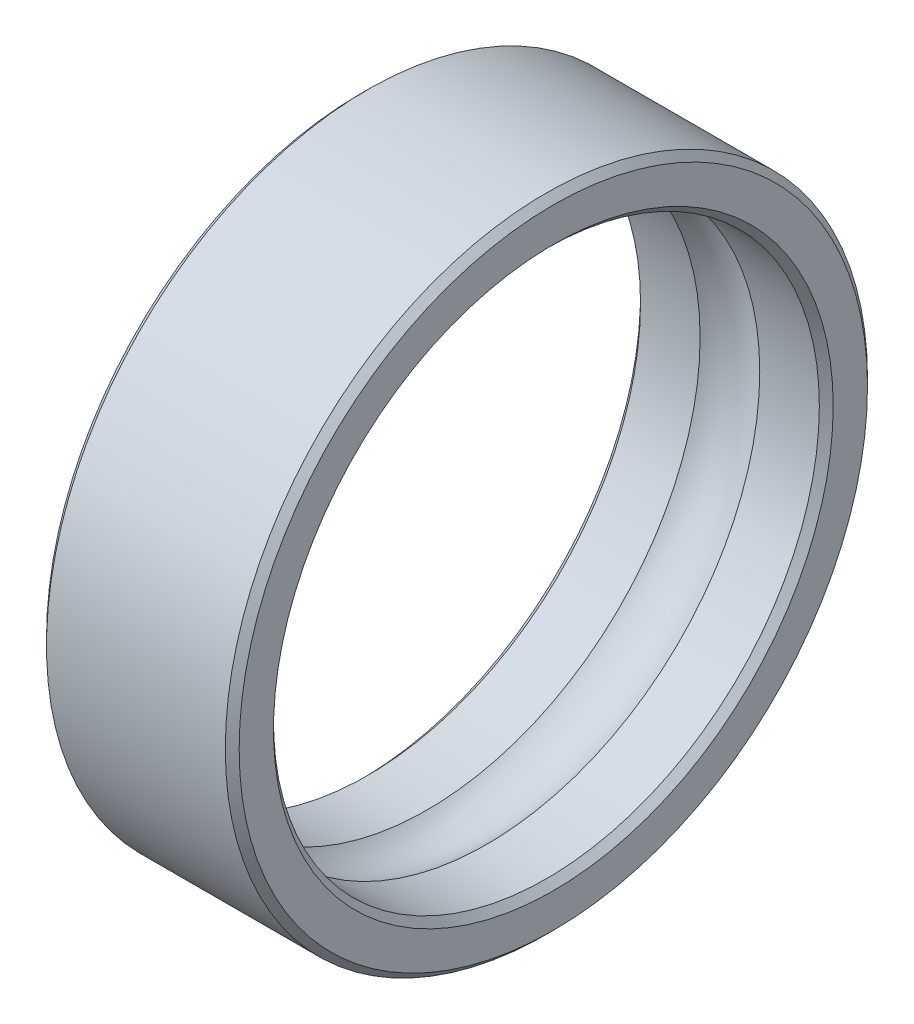
ISO-10303-21;
HEADER;
FILE_DESCRIPTION(('STEP AP214'),'2;1');
FILE_NAME('part.step','',(''),(''),'','','');
FILE_SCHEMA(('AUTOMOTIVE_DESIGN { 1 0 10303 214 1 1 1 1 }'));
ENDSEC;
DATA;
#1=APPLICATION_CONTEXT('core data for automotive mechanical design processes');
#2=APPLICATION_PROTOCOL_DEFINITION('international standard','automotive_design',2000,#1);
#3=PRODUCT_CONTEXT('',#1,'mechanical');
#4=PRODUCT('Part','Part','',(#3));
#5=PRODUCT_RELATED_PRODUCT_CATEGORY('part','',(#4));
#6=PRODUCT_DEFINITION_FORMATION('','',#4);
#7=PRODUCT_DEFINITION_CONTEXT('part definition',#1,'design');
#8=PRODUCT_DEFINITION('design','',#6,#7);
#9=PRODUCT_DEFINITION_SHAPE('','',#8);
#10=(LENGTH_UNIT() NAMED_UNIT(*) SI_UNIT(.MILLI.,.METRE.));
#11=(NAMED_UNIT(*) PLANE_ANGLE_UNIT() SI_UNIT($,.RADIAN.));
#12=(NAMED_UNIT(*) SI_UNIT($,.STERADIAN.) SOLID_ANGLE_UNIT());
#13=UNCERTAINTY_MEASURE_WITH_UNIT(LENGTH_MEASURE(1.E-05),#10,'distance_accuracy_value','');
#14=(GEOMETRIC_REPRESENTATION_CONTEXT(3) GLOBAL_UNCERTAINTY_ASSIGNED_CONTEXT((#13)) GLOBAL_UNIT_ASSIGNED_CONTEXT((#10,
#11,#12)) REPRESENTATION_CONTEXT('',''));
#15=CARTESIAN_POINT('',(0.,0.,0.));
#16=DIRECTION('',(0.,0.,1.));
#17=DIRECTION('',(1.,0.,0.));
#18=AXIS2_PLACEMENT_3D('',#15,#16,#17);
#19=CARTESIAN_POINT('',(0.,0.,0.));
#20=DIRECTION('',(1.,0.,0.));
#21=DIRECTION('',(0.,1.,0.));
#22=AXIS2_PLACEMENT_3D('',#19,#20,#21);
#23=TOROIDAL_SURFACE('',#22,14.644,3.);
#24=CARTESIAN_POINT('',(1.85721942699294,0.,0.));
#25=DIRECTION('',(1.,0.,0.));
#26=DIRECTION('',(0.,0.,-1.));
#27=AXIS2_PLACEMENT_3D('',#24,#25,#26);
#28=CIRCLE('',#27,17.);
#29=CARTESIAN_POINT('',(1.85721942699294,0.,-17.));
#30=VERTEX_POINT('',#29);
#31=EDGE_CURVE('E44',#30,#30,#28,.T.);
#32=ORIENTED_EDGE('',*,*,#31,.T.);
#33=EDGE_LOOP('',(#32));
#34=FACE_BOUND('',#33,.T.);
#35=CARTESIAN_POINT('',(-1.85721942699294,0.,0.));
#36=DIRECTION('',(1.,0.,0.));
#37=DIRECTION('',(0.,0.,-1.));
#38=AXIS2_PLACEMENT_3D('',#35,#36,#37);
#39=CIRCLE('',#38,17.);
#40=CARTESIAN_POINT('',(-1.85721942699294,0.,-17.));
#41=VERTEX_POINT('',#40);
#42=EDGE_CURVE('E39',#41,#41,#39,.F.);
#43=ORIENTED_EDGE('',*,*,#42,.T.);
#44=EDGE_LOOP('',(#43));
#45=FACE_BOUND('',#44,.T.);
#46=ADVANCED_FACE('F12',(#34,#45),#23,.F.);
#47=CARTESIAN_POINT('',(3.71294214523458,0.,0.));
#48=DIRECTION('',(1.,0.,0.));
#49=DIRECTION('',(0.,0.,-1.));
#50=AXIS2_PLACEMENT_3D('',#47,#48,#49);
#51=CYLINDRICAL_SURFACE('',#50,17.);
#52=CARTESIAN_POINT('',(5.56866486328266,0.,0.));
#53=DIRECTION('',(1.,0.,0.));
#54=DIRECTION('',(0.,1.,0.));
#55=AXIS2_PLACEMENT_3D('',#52,#53,#54);
#56=CIRCLE('',#55,17.0000000001936);
#57=CARTESIAN_POINT('',(5.56866486328266,17.0000000001936,0.));
#58=VERTEX_POINT('',#57);
#59=EDGE_CURVE('E34',#58,#58,#56,.T.);
#60=ORIENTED_EDGE('',*,*,#59,.T.);
#61=EDGE_LOOP('',(#60));
#62=FACE_BOUND('',#61,.T.);
#63=ORIENTED_EDGE('',*,*,#31,.F.);
#64=EDGE_LOOP('',(#63));
#65=FACE_BOUND('',#64,.T.);
#66=ADVANCED_FACE('F73',(#62,#65),#51,.F.);
#67=CARTESIAN_POINT('',(-3.71294214523457,0.,0.));
#68=DIRECTION('',(1.,0.,0.));
#69=DIRECTION('',(0.,0.,-1.));
#70=AXIS2_PLACEMENT_3D('',#67,#68,#69);
#71=CYLINDRICAL_SURFACE('',#70,17.);
#72=ORIENTED_EDGE('',*,*,#42,.F.);
#73=EDGE_LOOP('',(#72));
#74=FACE_BOUND('',#73,.T.);
#75=CARTESIAN_POINT('',(-5.56866486328265,0.,0.));
#76=DIRECTION('',(-1.,0.,0.));
#77=DIRECTION('',(0.,1.,0.));
#78=AXIS2_PLACEMENT_3D('',#75,#76,#77);
#79=CIRCLE('',#78,17.0000000001936);
#80=CARTESIAN_POINT('',(-5.56866486328266,17.0000000001936,0.));
#81=VERTEX_POINT('',#80);
#82=EDGE_CURVE('E31',#81,#81,#79,.T.);
#83=ORIENTED_EDGE('',*,*,#82,.T.);
#84=EDGE_LOOP('',(#83));
#85=FACE_BOUND('',#84,.T.);
#86=ADVANCED_FACE('F69',(#74,#85),#71,.F.);
#87=CARTESIAN_POINT('',(6.00000000019355,0.,0.));
#88=DIRECTION('',(1.,0.,0.));
#89=DIRECTION('',(0.,0.,-1.));
#90=AXIS2_PLACEMENT_3D('',#87,#88,#89);
#91=CONICAL_SURFACE('',#90,17.4313351363302,0.7853981625);
#92=CARTESIAN_POINT('',(6.00000000019355,0.,0.));
#93=DIRECTION('',(1.,0.,0.));
#94=DIRECTION('',(0.,0.,-1.));
#95=AXIS2_PLACEMENT_3D('',#92,#93,#94);
#96=CIRCLE('',#95,17.4313351363302);
#97=CARTESIAN_POINT('',(6.00000000019355,0.,-17.4313351363302));
#98=VERTEX_POINT('',#97);
#99=EDGE_CURVE('E15',#98,#98,#96,.F.);
#100=ORIENTED_EDGE('',*,*,#99,.F.);
#101=EDGE_LOOP('',(#100));
#102=FACE_BOUND('',#101,.T.);
#103=ORIENTED_EDGE('',*,*,#59,.F.);
#104=EDGE_LOOP('',(#103));
#105=FACE_BOUND('',#104,.T.);
#106=ADVANCED_FACE('F65',(#102,#105),#91,.F.);
#107=CARTESIAN_POINT('',(-6.00000000019355,0.,0.));
#108=DIRECTION('',(-1.,0.,0.));
#109=DIRECTION('',(0.,0.,1.));
#110=AXIS2_PLACEMENT_3D('',#107,#108,#109);
#111=CONICAL_SURFACE('',#110,17.4313351363302,0.785398162499998);
#112=ORIENTED_EDGE('',*,*,#82,.F.);
#113=EDGE_LOOP('',(#112));
#114=FACE_BOUND('',#113,.T.);
#115=CARTESIAN_POINT('',(-6.00000000019355,0.,0.));
#116=DIRECTION('',(-1.,0.,0.));
#117=DIRECTION('',(0.,0.,1.));
#118=AXIS2_PLACEMENT_3D('',#115,#116,#117);
#119=CIRCLE('',#118,17.4313351363302);
#120=CARTESIAN_POINT('',(-6.00000000019355,0.,17.4313351363302));
#121=VERTEX_POINT('',#120);
#122=EDGE_CURVE('E55',#121,#121,#119,.F.);
#123=ORIENTED_EDGE('',*,*,#122,.F.);
#124=EDGE_LOOP('',(#123));
#125=FACE_BOUND('',#124,.T.);
#126=ADVANCED_FACE('F68',(#114,#125),#111,.F.);
#127=CARTESIAN_POINT('',(6.,18.5,0.));
#128=DIRECTION('',(1.,0.,0.));
#129=DIRECTION('',(0.,0.,-1.));
#130=AXIS2_PLACEMENT_3D('',#127,#128,#129);
#131=PLANE('',#130);
#132=ORIENTED_EDGE('',*,*,#99,.T.);
#133=EDGE_LOOP('',(#132));
#134=FACE_BOUND('',#133,.T.);
#135=CARTESIAN_POINT('',(6.00000000019355,0.,0.));
#136=DIRECTION('',(-1.,0.,0.));
#137=DIRECTION('',(0.,0.,1.));
#138=AXIS2_PLACEMENT_3D('',#135,#136,#137);
#139=CIRCLE('',#138,19.5686648636698);
#140=CARTESIAN_POINT('',(6.00000000019355,0.,19.5686648636698));
#141=VERTEX_POINT('',#140);
#142=EDGE_CURVE('E53',#141,#141,#139,.T.);
#143=ORIENTED_EDGE('',*,*,#142,.F.);
#144=EDGE_LOOP('',(#143));
#145=FACE_BOUND('',#144,.T.);
#146=ADVANCED_FACE('F62',(#134,#145),#131,.T.);
#147=CARTESIAN_POINT('',(-6.,18.5,0.));
#148=DIRECTION('',(-1.,0.,0.));
#149=DIRECTION('',(0.,0.,1.));
#150=AXIS2_PLACEMENT_3D('',#147,#148,#149);
#151=PLANE('',#150);
#152=ORIENTED_EDGE('',*,*,#122,.T.);
#153=EDGE_LOOP('',(#152));
#154=FACE_BOUND('',#153,.T.);
#155=CARTESIAN_POINT('',(-6.00000000019355,0.,0.));
#156=DIRECTION('',(1.,0.,0.));
#157=DIRECTION('',(0.,0.,-1.));
#158=AXIS2_PLACEMENT_3D('',#155,#156,#157);
#159=CIRCLE('',#158,19.5686648636698);
#160=CARTESIAN_POINT('',(-6.00000000019355,0.,-19.5686648636698));
#161=VERTEX_POINT('',#160);
#162=EDGE_CURVE('E24',#161,#161,#159,.T.);
#163=ORIENTED_EDGE('',*,*,#162,.F.);
#164=EDGE_LOOP('',(#163));
#165=FACE_BOUND('',#164,.T.);
#166=ADVANCED_FACE('F94',(#154,#165),#151,.T.);
#167=CARTESIAN_POINT('',(5.56866486328266,0.,0.));
#168=DIRECTION('',(-1.,0.,0.));
#169=DIRECTION('',(0.,0.,1.));
#170=AXIS2_PLACEMENT_3D('',#167,#168,#169);
#171=CONICAL_SURFACE('',#170,19.9999999998065,0.785398162499998);
#172=CARTESIAN_POINT('',(5.56866486347621,0.,0.));
#173=DIRECTION('',(1.,0.,0.));
#174=DIRECTION('',(0.,0.,-1.));
#175=AXIS2_PLACEMENT_3D('',#172,#173,#174);
#176=CIRCLE('',#175,20.);
#177=CARTESIAN_POINT('',(5.56866486347621,0.,-20.));
#178=VERTEX_POINT('',#177);
#179=EDGE_CURVE('E19',#178,#178,#176,.F.);
#180=ORIENTED_EDGE('',*,*,#179,.F.);
#181=EDGE_LOOP('',(#180));
#182=FACE_BOUND('',#181,.T.);
#183=ORIENTED_EDGE('',*,*,#142,.T.);
#184=EDGE_LOOP('',(#183));
#185=FACE_BOUND('',#184,.T.);
#186=ADVANCED_FACE('F103',(#182,#185),#171,.T.);
#187=CARTESIAN_POINT('',(-5.56866486328266,0.,0.));
#188=DIRECTION('',(1.,0.,0.));
#189=DIRECTION('',(0.,0.,-1.));
#190=AXIS2_PLACEMENT_3D('',#187,#188,#189);
#191=CONICAL_SURFACE('',#190,19.9999999998065,0.785398162499999);
#192=ORIENTED_EDGE('',*,*,#162,.T.);
#193=EDGE_LOOP('',(#192));
#194=FACE_BOUND('',#193,.T.);
#195=CARTESIAN_POINT('',(-5.56866486347621,0.,0.));
#196=DIRECTION('',(1.,0.,0.));
#197=DIRECTION('',(0.,0.,-1.));
#198=AXIS2_PLACEMENT_3D('',#195,#196,#197);
#199=CIRCLE('',#198,20.);
#200=CARTESIAN_POINT('',(-5.56866486347621,0.,-20.));
#201=VERTEX_POINT('',#200);
#202=EDGE_CURVE('E8',#201,#201,#199,.T.);
#203=ORIENTED_EDGE('',*,*,#202,.F.);
#204=EDGE_LOOP('',(#203));
#205=FACE_BOUND('',#204,.T.);
#206=ADVANCED_FACE('F98',(#194,#205),#191,.T.);
#207=CARTESIAN_POINT('',(0.,0.,0.));
#208=DIRECTION('',(1.,0.,0.));
#209=DIRECTION('',(0.,0.,-1.));
#210=AXIS2_PLACEMENT_3D('',#207,#208,#209);
#211=CYLINDRICAL_SURFACE('',#210,20.);
#212=ORIENTED_EDGE('',*,*,#202,.T.);
#213=EDGE_LOOP('',(#212));
#214=FACE_BOUND('',#213,.T.);
#215=ORIENTED_EDGE('',*,*,#179,.T.);
#216=EDGE_LOOP('',(#215));
#217=FACE_BOUND('',#216,.T.);
#218=ADVANCED_FACE('F96',(#214,#217),#211,.T.);
#219=CLOSED_SHELL('',(#46,#66,#86,#106,#126,#146,#166,#186,#206,#218));
#220=MANIFOLD_SOLID_BREP('B1',#219);
#221=ADVANCED_BREP_SHAPE_REPRESENTATION('',(#18,#220),#14);
#222=SHAPE_DEFINITION_REPRESENTATION(#9,#221);
ENDSEC;
END-ISO-10303-21;
